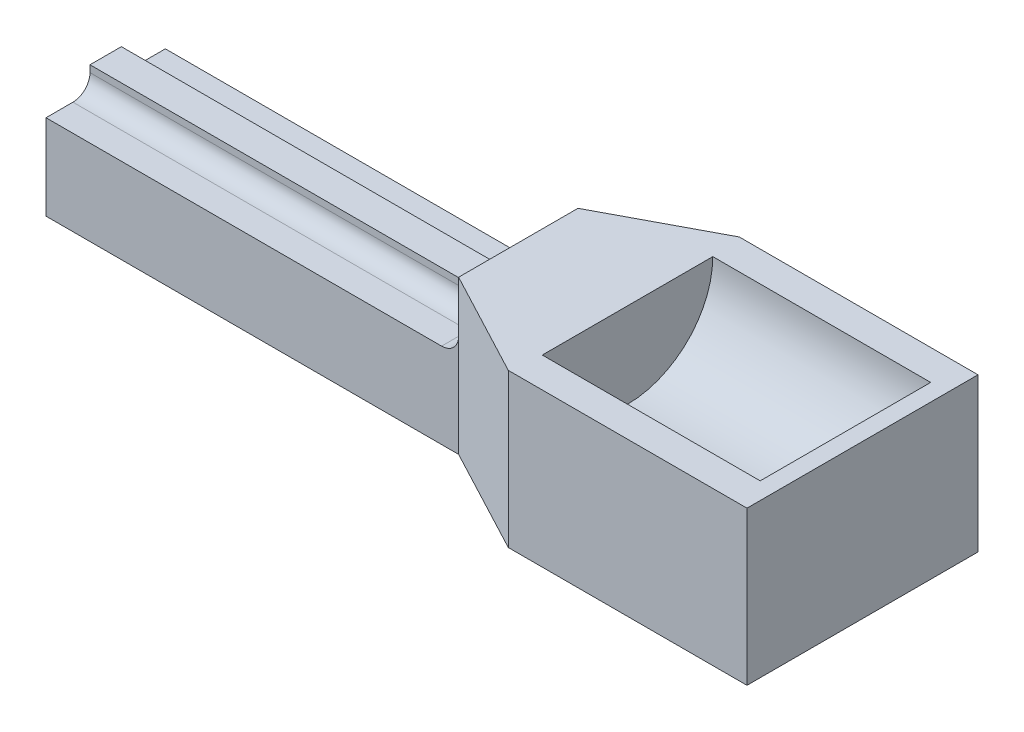
ISO-10303-21;
HEADER;
FILE_DESCRIPTION(('STEP AP214'),'2;1');
FILE_NAME('part.step','',(''),(''),'','','');
FILE_SCHEMA(('AUTOMOTIVE_DESIGN { 1 0 10303 214 1 1 1 1 }'));
ENDSEC;
DATA;
#1=APPLICATION_CONTEXT('core data for automotive mechanical design processes');
#2=APPLICATION_PROTOCOL_DEFINITION('international standard','automotive_design',2000,#1);
#3=PRODUCT_CONTEXT('',#1,'mechanical');
#4=PRODUCT('Part','Part','',(#3));
#5=PRODUCT_RELATED_PRODUCT_CATEGORY('part','',(#4));
#6=PRODUCT_DEFINITION_FORMATION('','',#4);
#7=PRODUCT_DEFINITION_CONTEXT('part definition',#1,'design');
#8=PRODUCT_DEFINITION('design','',#6,#7);
#9=PRODUCT_DEFINITION_SHAPE('','',#8);
#10=(LENGTH_UNIT() NAMED_UNIT(*) SI_UNIT(.MILLI.,.METRE.));
#11=(NAMED_UNIT(*) PLANE_ANGLE_UNIT() SI_UNIT($,.RADIAN.));
#12=(NAMED_UNIT(*) SI_UNIT($,.STERADIAN.) SOLID_ANGLE_UNIT());
#13=UNCERTAINTY_MEASURE_WITH_UNIT(LENGTH_MEASURE(1.E-05),#10,'distance_accuracy_value','');
#14=(GEOMETRIC_REPRESENTATION_CONTEXT(3) GLOBAL_UNCERTAINTY_ASSIGNED_CONTEXT((#13)) GLOBAL_UNIT_ASSIGNED_CONTEXT((#10,
#11,#12)) REPRESENTATION_CONTEXT('',''));
#15=CARTESIAN_POINT('',(0.,0.,0.));
#16=DIRECTION('',(0.,0.,1.));
#17=DIRECTION('',(1.,0.,0.));
#18=AXIS2_PLACEMENT_3D('',#15,#16,#17);
#19=CARTESIAN_POINT('',(295.934534334128,0.,0.));
#20=DIRECTION('',(-1.,0.,0.));
#21=DIRECTION('',(0.,0.,1.));
#22=AXIS2_PLACEMENT_3D('',#19,#20,#21);
#23=PLANE('',#22);
#24=DIRECTION('',(0.,0.,1.));
#25=VECTOR('',#24,1.);
#26=CARTESIAN_POINT('',(295.934534334128,45.,-33.87237262985));
#27=LINE('',#26,#25);
#28=CARTESIAN_POINT('',(295.934534334128,45.,-25.0000000000001));
#29=VERTEX_POINT('',#28);
#30=CARTESIAN_POINT('',(295.934534334128,45.,24.9999999999999));
#31=VERTEX_POINT('',#30);
#32=EDGE_CURVE('E190',#29,#31,#27,.T.);
#33=ORIENTED_EDGE('',*,*,#32,.F.);
#34=CARTESIAN_POINT('',(295.934534334128,45.,0.));
#35=DIRECTION('',(-1.,0.,0.));
#36=DIRECTION('',(0.,0.,1.));
#37=AXIS2_PLACEMENT_3D('',#34,#35,#36);
#38=CIRCLE('',#37,25.);
#39=EDGE_CURVE('E191',#29,#31,#38,.T.);
#40=ORIENTED_EDGE('',*,*,#39,.T.);
#41=EDGE_LOOP('',(#33,#40));
#42=FACE_BOUND('',#41,.T.);
#43=ADVANCED_FACE('F36',(#42),#23,.T.);
#44=CARTESIAN_POINT('',(295.934534334128,45.,-33.87237262985));
#45=DIRECTION('',(0.,0.,-1.));
#46=DIRECTION('',(0.,1.,0.));
#47=AXIS2_PLACEMENT_3D('',#44,#45,#46);
#48=PLANE('',#47);
#49=DIRECTION('',(0.,1.,0.));
#50=VECTOR('',#49,1.);
#51=CARTESIAN_POINT('',(300.934534334128,45.,-33.87237262985));
#52=LINE('',#51,#50);
#53=CARTESIAN_POINT('',(300.934534334128,0.,-33.87237262985));
#54=VERTEX_POINT('',#53);
#55=CARTESIAN_POINT('',(300.934534334128,45.,-33.87237262985));
#56=VERTEX_POINT('',#55);
#57=EDGE_CURVE('E193',#54,#56,#52,.T.);
#58=ORIENTED_EDGE('',*,*,#57,.F.);
#59=DIRECTION('',(1.,0.,0.));
#60=VECTOR('',#59,1.);
#61=CARTESIAN_POINT('',(295.934534334128,0.,-33.87237262985));
#62=LINE('',#61,#60);
#63=CARTESIAN_POINT('',(230.934534334128,0.,-33.87237262985));
#64=VERTEX_POINT('',#63);
#65=EDGE_CURVE('E11',#64,#54,#62,.T.);
#66=ORIENTED_EDGE('',*,*,#65,.F.);
#67=DIRECTION('',(0.,-1.,0.));
#68=VECTOR('',#67,1.);
#69=CARTESIAN_POINT('',(230.934534334128,45.,-33.87237262985));
#70=LINE('',#69,#68);
#71=CARTESIAN_POINT('',(230.934534334128,45.,-33.87237262985));
#72=VERTEX_POINT('',#71);
#73=EDGE_CURVE('E216',#72,#64,#70,.T.);
#74=ORIENTED_EDGE('',*,*,#73,.F.);
#75=DIRECTION('',(1.,0.,0.));
#76=VECTOR('',#75,1.);
#77=CARTESIAN_POINT('',(295.934534334128,45.,-33.87237262985));
#78=LINE('',#77,#76);
#79=EDGE_CURVE('E40',#72,#56,#78,.T.);
#80=ORIENTED_EDGE('',*,*,#79,.T.);
#81=EDGE_LOOP('',(#58,#66,#74,#80));
#82=FACE_BOUND('',#81,.T.);
#83=ADVANCED_FACE('F38',(#82),#48,.T.);
#84=CARTESIAN_POINT('',(295.934534334128,0.,-33.87237262985));
#85=DIRECTION('',(0.,-1.,0.));
#86=DIRECTION('',(0.,0.,-1.));
#87=AXIS2_PLACEMENT_3D('',#84,#85,#86);
#88=PLANE('',#87);
#89=DIRECTION('',(0.,0.,-1.));
#90=VECTOR('',#89,1.);
#91=CARTESIAN_POINT('',(300.934534334128,0.,-33.87237262985));
#92=LINE('',#91,#90);
#93=CARTESIAN_POINT('',(300.934534334128,0.,33.8723726298498));
#94=VERTEX_POINT('',#93);
#95=EDGE_CURVE('E198',#94,#54,#92,.T.);
#96=ORIENTED_EDGE('',*,*,#95,.F.);
#97=DIRECTION('',(1.,0.,0.));
#98=VECTOR('',#97,1.);
#99=CARTESIAN_POINT('',(295.934534334128,0.,33.8723726298498));
#100=LINE('',#99,#98);
#101=CARTESIAN_POINT('',(230.934534334128,0.,33.8723726298498));
#102=VERTEX_POINT('',#101);
#103=EDGE_CURVE('E45',#102,#94,#100,.T.);
#104=ORIENTED_EDGE('',*,*,#103,.F.);
#105=DIRECTION('',(0.883843838117942,0.,0.467782075138569));
#106=VECTOR('',#105,1.);
#107=CARTESIAN_POINT('',(200.,0.,17.4999999999999));
#108=LINE('',#107,#106);
#109=CARTESIAN_POINT('',(200.,0.,17.4999999999999));
#110=VERTEX_POINT('',#109);
#111=EDGE_CURVE('E224',#110,#102,#108,.T.);
#112=ORIENTED_EDGE('',*,*,#111,.F.);
#113=DIRECTION('',(1.,0.,0.));
#114=VECTOR('',#113,1.);
#115=CARTESIAN_POINT('',(-210.,0.,17.5));
#116=LINE('',#115,#114);
#117=CARTESIAN_POINT('',(79.,0.,17.5));
#118=VERTEX_POINT('',#117);
#119=EDGE_CURVE('E250',#118,#110,#116,.T.);
#120=ORIENTED_EDGE('',*,*,#119,.F.);
#121=DIRECTION('',(0.,0.,-1.));
#122=VECTOR('',#121,1.);
#123=CARTESIAN_POINT('',(79.,0.,0.));
#124=LINE('',#123,#122);
#125=CARTESIAN_POINT('',(79.,0.,-17.5000000000001));
#126=VERTEX_POINT('',#125);
#127=EDGE_CURVE('E285',#118,#126,#124,.T.);
#128=ORIENTED_EDGE('',*,*,#127,.T.);
#129=DIRECTION('',(1.,0.,0.));
#130=VECTOR('',#129,1.);
#131=CARTESIAN_POINT('',(-210.,0.,-17.5));
#132=LINE('',#131,#130);
#133=CARTESIAN_POINT('',(200.,0.,-17.5000000000001));
#134=VERTEX_POINT('',#133);
#135=EDGE_CURVE('E248',#126,#134,#132,.T.);
#136=ORIENTED_EDGE('',*,*,#135,.T.);
#137=DIRECTION('',(-0.883843838117942,0.,0.467782075138569));
#138=VECTOR('',#137,1.);
#139=CARTESIAN_POINT('',(230.934534334128,0.,-33.87237262985));
#140=LINE('',#139,#138);
#141=EDGE_CURVE('E237',#64,#134,#140,.T.);
#142=ORIENTED_EDGE('',*,*,#141,.F.);
#143=ORIENTED_EDGE('',*,*,#65,.T.);
#144=EDGE_LOOP('',(#96,#104,#112,#120,#128,#136,#142,#143));
#145=FACE_BOUND('',#144,.T.);
#146=ADVANCED_FACE('F220',(#145),#88,.T.);
#147=CARTESIAN_POINT('',(295.934534334128,45.,33.8723726298498));
#148=DIRECTION('',(0.,0.,1.));
#149=DIRECTION('',(0.,-1.,0.));
#150=AXIS2_PLACEMENT_3D('',#147,#148,#149);
#151=PLANE('',#150);
#152=DIRECTION('',(0.,-1.,0.));
#153=VECTOR('',#152,1.);
#154=CARTESIAN_POINT('',(300.934534334128,45.,33.8723726298498));
#155=LINE('',#154,#153);
#156=CARTESIAN_POINT('',(300.934534334128,45.,33.8723726298498));
#157=VERTEX_POINT('',#156);
#158=EDGE_CURVE('E203',#157,#94,#155,.T.);
#159=ORIENTED_EDGE('',*,*,#158,.F.);
#160=DIRECTION('',(1.,0.,0.));
#161=VECTOR('',#160,1.);
#162=CARTESIAN_POINT('',(295.934534334128,45.,33.8723726298498));
#163=LINE('',#162,#161);
#164=CARTESIAN_POINT('',(230.934534334128,45.,33.8723726298498));
#165=VERTEX_POINT('',#164);
#166=EDGE_CURVE('E208',#165,#157,#163,.T.);
#167=ORIENTED_EDGE('',*,*,#166,.F.);
#168=DIRECTION('',(0.,-1.,0.));
#169=VECTOR('',#168,1.);
#170=CARTESIAN_POINT('',(230.934534334128,45.,33.8723726298498));
#171=LINE('',#170,#169);
#172=EDGE_CURVE('E227',#165,#102,#171,.T.);
#173=ORIENTED_EDGE('',*,*,#172,.T.);
#174=ORIENTED_EDGE('',*,*,#103,.T.);
#175=EDGE_LOOP('',(#159,#167,#173,#174));
#176=FACE_BOUND('',#175,.T.);
#177=ADVANCED_FACE('F228',(#176),#151,.T.);
#178=CARTESIAN_POINT('',(295.934534334128,45.,-33.87237262985));
#179=DIRECTION('',(0.,1.,0.));
#180=DIRECTION('',(0.,0.,1.));
#181=AXIS2_PLACEMENT_3D('',#178,#179,#180);
#182=PLANE('',#181);
#183=DIRECTION('',(1.,0.,0.));
#184=VECTOR('',#183,1.);
#185=CARTESIAN_POINT('',(232.034534334128,45.,-25.0000000000001));
#186=LINE('',#185,#184);
#187=CARTESIAN_POINT('',(232.034534334128,45.,-25.0000000000001));
#188=VERTEX_POINT('',#187);
#189=EDGE_CURVE('E180',#29,#188,#186,.F.);
#190=ORIENTED_EDGE('',*,*,#189,.F.);
#191=ORIENTED_EDGE('',*,*,#32,.T.);
#192=DIRECTION('',(1.,0.,0.));
#193=VECTOR('',#192,1.);
#194=CARTESIAN_POINT('',(232.034534334128,45.,24.9999999999999));
#195=LINE('',#194,#193);
#196=CARTESIAN_POINT('',(232.034534334128,45.,24.9999999999999));
#197=VERTEX_POINT('',#196);
#198=EDGE_CURVE('E53',#197,#31,#195,.T.);
#199=ORIENTED_EDGE('',*,*,#198,.F.);
#200=DIRECTION('',(0.,0.,-1.));
#201=VECTOR('',#200,1.);
#202=CARTESIAN_POINT('',(232.034534334128,45.,0.));
#203=LINE('',#202,#201);
#204=EDGE_CURVE('E175',#197,#188,#203,.T.);
#205=ORIENTED_EDGE('',*,*,#204,.T.);
#206=EDGE_LOOP('',(#190,#191,#199,#205));
#207=FACE_BOUND('',#206,.T.);
#208=ORIENTED_EDGE('',*,*,#79,.F.);
#209=DIRECTION('',(-0.883843838117942,0.,0.467782075138569));
#210=VECTOR('',#209,1.);
#211=CARTESIAN_POINT('',(230.934534334128,45.,-33.87237262985));
#212=LINE('',#211,#210);
#213=CARTESIAN_POINT('',(200.,45.,-17.5000000000001));
#214=VERTEX_POINT('',#213);
#215=EDGE_CURVE('E344',#72,#214,#212,.T.);
#216=ORIENTED_EDGE('',*,*,#215,.T.);
#217=DIRECTION('',(0.,0.,1.));
#218=VECTOR('',#217,1.);
#219=CARTESIAN_POINT('',(200.,45.,-17.5000000000001));
#220=LINE('',#219,#218);
#221=CARTESIAN_POINT('',(200.,45.,17.4999999999999));
#222=VERTEX_POINT('',#221);
#223=EDGE_CURVE('E242',#214,#222,#220,.T.);
#224=ORIENTED_EDGE('',*,*,#223,.T.);
#225=DIRECTION('',(0.883843838117942,0.,0.467782075138569));
#226=VECTOR('',#225,1.);
#227=CARTESIAN_POINT('',(200.,45.,17.4999999999999));
#228=LINE('',#227,#226);
#229=EDGE_CURVE('E346',#222,#165,#228,.T.);
#230=ORIENTED_EDGE('',*,*,#229,.T.);
#231=ORIENTED_EDGE('',*,*,#166,.T.);
#232=DIRECTION('',(0.,0.,1.));
#233=VECTOR('',#232,1.);
#234=CARTESIAN_POINT('',(300.934534334128,45.,-33.87237262985));
#235=LINE('',#234,#233);
#236=EDGE_CURVE('E201',#56,#157,#235,.T.);
#237=ORIENTED_EDGE('',*,*,#236,.F.);
#238=EDGE_LOOP('',(#208,#216,#224,#230,#231,#237));
#239=FACE_BOUND('',#238,.T.);
#240=ADVANCED_FACE('F187',(#207,#239),#182,.T.);
#241=CARTESIAN_POINT('',(300.934534334128,0.,0.));
#242=DIRECTION('',(-1.,0.,0.));
#243=DIRECTION('',(0.,0.,1.));
#244=AXIS2_PLACEMENT_3D('',#241,#242,#243);
#245=PLANE('',#244);
#246=ORIENTED_EDGE('',*,*,#236,.T.);
#247=ORIENTED_EDGE('',*,*,#158,.T.);
#248=ORIENTED_EDGE('',*,*,#95,.T.);
#249=ORIENTED_EDGE('',*,*,#57,.T.);
#250=EDGE_LOOP('',(#246,#247,#248,#249));
#251=FACE_BOUND('',#250,.T.);
#252=ADVANCED_FACE('F219',(#251),#245,.F.);
#253=CARTESIAN_POINT('',(79.,45.01,-81.1966355679578));
#254=DIRECTION('',(-1.,0.,0.));
#255=DIRECTION('',(0.,0.,1.));
#256=AXIS2_PLACEMENT_3D('',#253,#254,#255);
#257=PLANE('',#256);
#258=DIRECTION('',(0.,1.,0.));
#259=VECTOR('',#258,1.);
#260=CARTESIAN_POINT('',(79.,25.,17.5));
#261=LINE('',#260,#259);
#262=CARTESIAN_POINT('',(79.,25.,17.5));
#263=VERTEX_POINT('',#262);
#264=EDGE_CURVE('E276',#118,#263,#261,.T.);
#265=ORIENTED_EDGE('',*,*,#264,.T.);
#266=DIRECTION('',(0.,0.,-1.));
#267=VECTOR('',#266,1.);
#268=CARTESIAN_POINT('',(79.,25.,0.));
#269=LINE('',#268,#267);
#270=CARTESIAN_POINT('',(79.,25.,9.60000000000005));
#271=VERTEX_POINT('',#270);
#272=EDGE_CURVE('E279',#263,#271,#269,.T.);
#273=ORIENTED_EDGE('',*,*,#272,.T.);
#274=CARTESIAN_POINT('',(79.,30.,9.60000000000005));
#275=DIRECTION('',(-1.,0.,0.));
#276=DIRECTION('',(0.,0.,1.));
#277=AXIS2_PLACEMENT_3D('',#274,#275,#276);
#278=CIRCLE('',#277,5.);
#279=CARTESIAN_POINT('',(79.,30.,4.60000000000004));
#280=VERTEX_POINT('',#279);
#281=EDGE_CURVE('E267',#271,#280,#278,.F.);
#282=ORIENTED_EDGE('',*,*,#281,.T.);
#283=DIRECTION('',(0.,1.,0.));
#284=VECTOR('',#283,1.);
#285=CARTESIAN_POINT('',(79.,32.,4.60000000000004));
#286=LINE('',#285,#284);
#287=CARTESIAN_POINT('',(79.,32.,4.60000000000004));
#288=VERTEX_POINT('',#287);
#289=EDGE_CURVE('E273',#280,#288,#286,.T.);
#290=ORIENTED_EDGE('',*,*,#289,.T.);
#291=DIRECTION('',(0.,0.,1.));
#292=VECTOR('',#291,1.);
#293=CARTESIAN_POINT('',(79.,32.,0.));
#294=LINE('',#293,#292);
#295=CARTESIAN_POINT('',(79.,32.,-4.6));
#296=VERTEX_POINT('',#295);
#297=EDGE_CURVE('E290',#296,#288,#294,.T.);
#298=ORIENTED_EDGE('',*,*,#297,.F.);
#299=DIRECTION('',(0.,-1.,0.));
#300=VECTOR('',#299,1.);
#301=CARTESIAN_POINT('',(79.,32.,-4.6));
#302=LINE('',#301,#300);
#303=CARTESIAN_POINT('',(79.,30.,-4.6));
#304=VERTEX_POINT('',#303);
#305=EDGE_CURVE('E270',#296,#304,#302,.T.);
#306=ORIENTED_EDGE('',*,*,#305,.T.);
#307=CARTESIAN_POINT('',(79.,30.,-9.6));
#308=DIRECTION('',(-1.,0.,0.));
#309=DIRECTION('',(0.,0.,1.));
#310=AXIS2_PLACEMENT_3D('',#307,#308,#309);
#311=CIRCLE('',#310,5.);
#312=CARTESIAN_POINT('',(79.,25.,-9.6));
#313=VERTEX_POINT('',#312);
#314=EDGE_CURVE('E184',#304,#313,#311,.F.);
#315=ORIENTED_EDGE('',*,*,#314,.T.);
#316=DIRECTION('',(0.,0.,-1.));
#317=VECTOR('',#316,1.);
#318=CARTESIAN_POINT('',(79.,25.,0.));
#319=LINE('',#318,#317);
#320=CARTESIAN_POINT('',(79.,25.,-17.5000000000001));
#321=VERTEX_POINT('',#320);
#322=EDGE_CURVE('E282',#313,#321,#319,.T.);
#323=ORIENTED_EDGE('',*,*,#322,.T.);
#324=DIRECTION('',(0.,1.,0.));
#325=VECTOR('',#324,1.);
#326=CARTESIAN_POINT('',(79.,25.,-17.5000000000001));
#327=LINE('',#326,#325);
#328=EDGE_CURVE('E288',#126,#321,#327,.T.);
#329=ORIENTED_EDGE('',*,*,#328,.F.);
#330=ORIENTED_EDGE('',*,*,#127,.F.);
#331=EDGE_LOOP('',(#265,#273,#282,#290,#298,#306,#315,#323,#329,#330));
#332=FACE_BOUND('',#331,.T.);
#333=ADVANCED_FACE('F366',(#332),#257,.T.);
#334=CARTESIAN_POINT('',(0.,25.,0.));
#335=DIRECTION('',(0.,-1.,0.));
#336=DIRECTION('',(0.,0.,-1.));
#337=AXIS2_PLACEMENT_3D('',#334,#335,#336);
#338=PLANE('',#337);
#339=ORIENTED_EDGE('',*,*,#322,.F.);
#340=DIRECTION('',(-1.,0.,0.));
#341=VECTOR('',#340,1.);
#342=CARTESIAN_POINT('',(200.,25.,-9.6));
#343=LINE('',#342,#341);
#344=CARTESIAN_POINT('',(195.,25.,-9.6));
#345=VERTEX_POINT('',#344);
#346=EDGE_CURVE('E260',#313,#345,#343,.F.);
#347=ORIENTED_EDGE('',*,*,#346,.T.);
#348=DIRECTION('',(0.,0.,1.));
#349=VECTOR('',#348,1.);
#350=CARTESIAN_POINT('',(195.,25.,-17.5000000000001));
#351=LINE('',#350,#349);
#352=CARTESIAN_POINT('',(195.,25.,-17.5000000000001));
#353=VERTEX_POINT('',#352);
#354=EDGE_CURVE('E303',#345,#353,#351,.F.);
#355=ORIENTED_EDGE('',*,*,#354,.T.);
#356=DIRECTION('',(1.,0.,0.));
#357=VECTOR('',#356,1.);
#358=CARTESIAN_POINT('',(-210.,25.,-17.5));
#359=LINE('',#358,#357);
#360=EDGE_CURVE('E252',#321,#353,#359,.T.);
#361=ORIENTED_EDGE('',*,*,#360,.F.);
#362=EDGE_LOOP('',(#339,#347,#355,#361));
#363=FACE_BOUND('',#362,.T.);
#364=ADVANCED_FACE('F430',(#363),#338,.F.);
#365=ORIENTED_EDGE('',*,*,#272,.F.);
#366=DIRECTION('',(1.,0.,0.));
#367=VECTOR('',#366,1.);
#368=CARTESIAN_POINT('',(-210.,25.,17.5));
#369=LINE('',#368,#367);
#370=CARTESIAN_POINT('',(195.,25.,17.5));
#371=VERTEX_POINT('',#370);
#372=EDGE_CURVE('E254',#263,#371,#369,.T.);
#373=ORIENTED_EDGE('',*,*,#372,.T.);
#374=DIRECTION('',(0.,0.,1.));
#375=VECTOR('',#374,1.);
#376=CARTESIAN_POINT('',(195.,25.,9.6));
#377=LINE('',#376,#375);
#378=CARTESIAN_POINT('',(195.,25.,9.6));
#379=VERTEX_POINT('',#378);
#380=EDGE_CURVE('E310',#371,#379,#377,.F.);
#381=ORIENTED_EDGE('',*,*,#380,.T.);
#382=DIRECTION('',(1.,0.,0.));
#383=VECTOR('',#382,1.);
#384=CARTESIAN_POINT('',(-8.35065268889029,25.,9.60000000000008));
#385=LINE('',#384,#383);
#386=EDGE_CURVE('E256',#379,#271,#385,.F.);
#387=ORIENTED_EDGE('',*,*,#386,.T.);
#388=EDGE_LOOP('',(#365,#373,#381,#387));
#389=FACE_BOUND('',#388,.T.);
#390=ADVANCED_FACE('F417',(#389),#338,.F.);
#391=CARTESIAN_POINT('',(-210.,25.,17.5));
#392=DIRECTION('',(0.,0.,-1.));
#393=DIRECTION('',(-1.,0.,0.));
#394=AXIS2_PLACEMENT_3D('',#391,#392,#393);
#395=PLANE('',#394);
#396=ORIENTED_EDGE('',*,*,#264,.F.);
#397=ORIENTED_EDGE('',*,*,#119,.T.);
#398=DIRECTION('',(0.,-1.,0.));
#399=VECTOR('',#398,1.);
#400=CARTESIAN_POINT('',(200.,25.,17.4999999999999));
#401=LINE('',#400,#399);
#402=CARTESIAN_POINT('',(200.,30.,17.4999999999999));
#403=VERTEX_POINT('',#402);
#404=EDGE_CURVE('E235',#403,#110,#401,.T.);
#405=ORIENTED_EDGE('',*,*,#404,.F.);
#406=CARTESIAN_POINT('',(195.,30.,17.4999999999999));
#407=DIRECTION('',(0.,0.,-1.));
#408=DIRECTION('',(-1.,0.,0.));
#409=AXIS2_PLACEMENT_3D('',#406,#407,#408);
#410=CIRCLE('',#409,5.);
#411=EDGE_CURVE('E296',#403,#371,#410,.T.);
#412=ORIENTED_EDGE('',*,*,#411,.T.);
#413=ORIENTED_EDGE('',*,*,#372,.F.);
#414=EDGE_LOOP('',(#396,#397,#405,#412,#413));
#415=FACE_BOUND('',#414,.T.);
#416=ADVANCED_FACE('F361',(#415),#395,.F.);
#417=CARTESIAN_POINT('',(-210.,25.,-17.5));
#418=DIRECTION('',(0.,0.,-1.));
#419=DIRECTION('',(-1.,0.,0.));
#420=AXIS2_PLACEMENT_3D('',#417,#418,#419);
#421=PLANE('',#420);
#422=ORIENTED_EDGE('',*,*,#135,.F.);
#423=ORIENTED_EDGE('',*,*,#328,.T.);
#424=ORIENTED_EDGE('',*,*,#360,.T.);
#425=CARTESIAN_POINT('',(195.,30.,-17.5000000000001));
#426=DIRECTION('',(0.,0.,-1.));
#427=DIRECTION('',(-1.,0.,0.));
#428=AXIS2_PLACEMENT_3D('',#425,#426,#427);
#429=CIRCLE('',#428,5.);
#430=CARTESIAN_POINT('',(200.,30.,-17.5000000000001));
#431=VERTEX_POINT('',#430);
#432=EDGE_CURVE('E292',#353,#431,#429,.F.);
#433=ORIENTED_EDGE('',*,*,#432,.T.);
#434=DIRECTION('',(0.,1.,0.));
#435=VECTOR('',#434,1.);
#436=CARTESIAN_POINT('',(200.,0.,-17.5000000000001));
#437=LINE('',#436,#435);
#438=EDGE_CURVE('E337',#134,#431,#437,.T.);
#439=ORIENTED_EDGE('',*,*,#438,.F.);
#440=EDGE_LOOP('',(#422,#423,#424,#433,#439));
#441=FACE_BOUND('',#440,.T.);
#442=ADVANCED_FACE('F369',(#441),#421,.T.);
#443=CARTESIAN_POINT('',(-21.,32.,0.));
#444=DIRECTION('',(0.,1.,0.));
#445=DIRECTION('',(0.,0.,1.));
#446=AXIS2_PLACEMENT_3D('',#443,#444,#445);
#447=PLANE('',#446);
#448=DIRECTION('',(-1.,0.,0.));
#449=VECTOR('',#448,1.);
#450=CARTESIAN_POINT('',(200.,32.,-4.6));
#451=LINE('',#450,#449);
#452=CARTESIAN_POINT('',(195.,32.,-4.6));
#453=VERTEX_POINT('',#452);
#454=EDGE_CURVE('E236',#453,#296,#451,.T.);
#455=ORIENTED_EDGE('',*,*,#454,.T.);
#456=ORIENTED_EDGE('',*,*,#297,.T.);
#457=DIRECTION('',(1.,0.,0.));
#458=VECTOR('',#457,1.);
#459=CARTESIAN_POINT('',(200.,32.,4.6));
#460=LINE('',#459,#458);
#461=CARTESIAN_POINT('',(195.,32.,4.6));
#462=VERTEX_POINT('',#461);
#463=EDGE_CURVE('E239',#288,#462,#460,.T.);
#464=ORIENTED_EDGE('',*,*,#463,.T.);
#465=DIRECTION('',(0.,0.,-1.));
#466=VECTOR('',#465,1.);
#467=CARTESIAN_POINT('',(195.,32.,0.));
#468=LINE('',#467,#466);
#469=EDGE_CURVE('E312',#462,#453,#468,.T.);
#470=ORIENTED_EDGE('',*,*,#469,.T.);
#471=EDGE_LOOP('',(#455,#456,#464,#470));
#472=FACE_BOUND('',#471,.T.);
#473=ADVANCED_FACE('F421',(#472),#447,.T.);
#474=CARTESIAN_POINT('',(200.,32.,4.6));
#475=DIRECTION('',(0.,0.,-1.));
#476=DIRECTION('',(-1.,0.,0.));
#477=AXIS2_PLACEMENT_3D('',#474,#475,#476);
#478=PLANE('',#477);
#479=ORIENTED_EDGE('',*,*,#289,.F.);
#480=DIRECTION('',(1.,0.,0.));
#481=VECTOR('',#480,1.);
#482=CARTESIAN_POINT('',(200.,30.,4.6));
#483=LINE('',#482,#481);
#484=CARTESIAN_POINT('',(195.,30.,4.6));
#485=VERTEX_POINT('',#484);
#486=EDGE_CURVE('E258',#280,#485,#483,.T.);
#487=ORIENTED_EDGE('',*,*,#486,.T.);
#488=DIRECTION('',(0.,-1.,0.));
#489=VECTOR('',#488,1.);
#490=CARTESIAN_POINT('',(195.,32.,4.6));
#491=LINE('',#490,#489);
#492=EDGE_CURVE('E322',#485,#462,#491,.F.);
#493=ORIENTED_EDGE('',*,*,#492,.T.);
#494=ORIENTED_EDGE('',*,*,#463,.F.);
#495=EDGE_LOOP('',(#479,#487,#493,#494));
#496=FACE_BOUND('',#495,.T.);
#497=ADVANCED_FACE('F420',(#496),#478,.F.);
#498=CARTESIAN_POINT('',(200.,32.,-4.6));
#499=DIRECTION('',(0.,0.,1.));
#500=DIRECTION('',(1.,0.,0.));
#501=AXIS2_PLACEMENT_3D('',#498,#499,#500);
#502=PLANE('',#501);
#503=ORIENTED_EDGE('',*,*,#305,.F.);
#504=ORIENTED_EDGE('',*,*,#454,.F.);
#505=DIRECTION('',(0.,-1.,0.));
#506=VECTOR('',#505,1.);
#507=CARTESIAN_POINT('',(195.,30.,-4.6));
#508=LINE('',#507,#506);
#509=CARTESIAN_POINT('',(195.,30.,-4.6));
#510=VERTEX_POINT('',#509);
#511=EDGE_CURVE('E317',#453,#510,#508,.T.);
#512=ORIENTED_EDGE('',*,*,#511,.T.);
#513=DIRECTION('',(-1.,0.,0.));
#514=VECTOR('',#513,1.);
#515=CARTESIAN_POINT('',(-8.35065268889029,30.,-4.6));
#516=LINE('',#515,#514);
#517=EDGE_CURVE('E262',#510,#304,#516,.T.);
#518=ORIENTED_EDGE('',*,*,#517,.T.);
#519=EDGE_LOOP('',(#503,#504,#512,#518));
#520=FACE_BOUND('',#519,.T.);
#521=ADVANCED_FACE('F424',(#520),#502,.F.);
#522=CARTESIAN_POINT('',(200.,30.,9.6));
#523=DIRECTION('',(-1.,0.,0.));
#524=DIRECTION('',(0.,0.,1.));
#525=AXIS2_PLACEMENT_3D('',#522,#523,#524);
#526=CYLINDRICAL_SURFACE('',#525,5.);
#527=ORIENTED_EDGE('',*,*,#281,.F.);
#528=ORIENTED_EDGE('',*,*,#386,.F.);
#529=CARTESIAN_POINT('',(195.,30.,9.6));
#530=DIRECTION('',(-1.,0.,0.));
#531=DIRECTION('',(0.,0.,1.));
#532=AXIS2_PLACEMENT_3D('',#529,#530,#531);
#533=CIRCLE('',#532,5.);
#534=EDGE_CURVE('E319',#379,#485,#533,.F.);
#535=ORIENTED_EDGE('',*,*,#534,.T.);
#536=ORIENTED_EDGE('',*,*,#486,.F.);
#537=EDGE_LOOP('',(#527,#528,#535,#536));
#538=FACE_BOUND('',#537,.T.);
#539=ADVANCED_FACE('F414',(#538),#526,.F.);
#540=CARTESIAN_POINT('',(200.,30.,-9.6));
#541=DIRECTION('',(1.,0.,0.));
#542=DIRECTION('',(0.,0.,-1.));
#543=AXIS2_PLACEMENT_3D('',#540,#541,#542);
#544=CYLINDRICAL_SURFACE('',#543,5.);
#545=ORIENTED_EDGE('',*,*,#314,.F.);
#546=ORIENTED_EDGE('',*,*,#517,.F.);
#547=CARTESIAN_POINT('',(195.,30.,-9.6));
#548=DIRECTION('',(1.,0.,0.));
#549=DIRECTION('',(0.,0.,-1.));
#550=AXIS2_PLACEMENT_3D('',#547,#548,#549);
#551=CIRCLE('',#550,5.);
#552=EDGE_CURVE('E314',#510,#345,#551,.T.);
#553=ORIENTED_EDGE('',*,*,#552,.T.);
#554=ORIENTED_EDGE('',*,*,#346,.F.);
#555=EDGE_LOOP('',(#545,#546,#553,#554));
#556=FACE_BOUND('',#555,.T.);
#557=ADVANCED_FACE('F428',(#556),#544,.F.);
#558=CARTESIAN_POINT('',(200.,45.,-17.5000000000001));
#559=DIRECTION('',(1.,0.,0.));
#560=DIRECTION('',(0.,0.,-1.));
#561=AXIS2_PLACEMENT_3D('',#558,#559,#560);
#562=PLANE('',#561);
#563=DIRECTION('',(0.,-1.,0.));
#564=VECTOR('',#563,1.);
#565=CARTESIAN_POINT('',(200.,30.,9.6));
#566=LINE('',#565,#564);
#567=CARTESIAN_POINT('',(200.,37.,9.6));
#568=VERTEX_POINT('',#567);
#569=CARTESIAN_POINT('',(200.,30.,9.6));
#570=VERTEX_POINT('',#569);
#571=EDGE_CURVE('E328',#568,#570,#566,.T.);
#572=ORIENTED_EDGE('',*,*,#571,.T.);
#573=DIRECTION('',(0.,0.,1.));
#574=VECTOR('',#573,1.);
#575=CARTESIAN_POINT('',(200.,30.,17.4999999999999));
#576=LINE('',#575,#574);
#577=EDGE_CURVE('E325',#570,#403,#576,.T.);
#578=ORIENTED_EDGE('',*,*,#577,.T.);
#579=DIRECTION('',(0.,-1.,0.));
#580=VECTOR('',#579,1.);
#581=CARTESIAN_POINT('',(200.,45.,17.4999999999999));
#582=LINE('',#581,#580);
#583=EDGE_CURVE('E230',#222,#403,#582,.T.);
#584=ORIENTED_EDGE('',*,*,#583,.F.);
#585=ORIENTED_EDGE('',*,*,#223,.F.);
#586=DIRECTION('',(0.,-1.,0.));
#587=VECTOR('',#586,1.);
#588=CARTESIAN_POINT('',(200.,45.,-17.5000000000001));
#589=LINE('',#588,#587);
#590=EDGE_CURVE('E341',#214,#431,#589,.T.);
#591=ORIENTED_EDGE('',*,*,#590,.T.);
#592=DIRECTION('',(0.,0.,1.));
#593=VECTOR('',#592,1.);
#594=CARTESIAN_POINT('',(200.,30.,-9.6));
#595=LINE('',#594,#593);
#596=CARTESIAN_POINT('',(200.,30.,-9.6));
#597=VERTEX_POINT('',#596);
#598=EDGE_CURVE('E264',#431,#597,#595,.T.);
#599=ORIENTED_EDGE('',*,*,#598,.T.);
#600=DIRECTION('',(0.,-1.,0.));
#601=VECTOR('',#600,1.);
#602=CARTESIAN_POINT('',(200.,32.,-9.6));
#603=LINE('',#602,#601);
#604=CARTESIAN_POINT('',(200.,37.,-9.6));
#605=VERTEX_POINT('',#604);
#606=EDGE_CURVE('E333',#597,#605,#603,.F.);
#607=ORIENTED_EDGE('',*,*,#606,.T.);
#608=DIRECTION('',(0.,0.,-1.));
#609=VECTOR('',#608,1.);
#610=CARTESIAN_POINT('',(200.,37.,-17.5000000000001));
#611=LINE('',#610,#609);
#612=EDGE_CURVE('E331',#605,#568,#611,.F.);
#613=ORIENTED_EDGE('',*,*,#612,.T.);
#614=EDGE_LOOP('',(#572,#578,#584,#585,#591,#599,#607,#613));
#615=FACE_BOUND('',#614,.T.);
#616=ADVANCED_FACE('F352',(#615),#562,.F.);
#617=CARTESIAN_POINT('',(200.,45.,17.4999999999999));
#618=DIRECTION('',(0.467782075138569,0.,-0.883843838117942));
#619=DIRECTION('',(-0.883843838117942,0.,-0.467782075138569));
#620=AXIS2_PLACEMENT_3D('',#617,#618,#619);
#621=PLANE('',#620);
#622=ORIENTED_EDGE('',*,*,#583,.T.);
#623=ORIENTED_EDGE('',*,*,#404,.T.);
#624=ORIENTED_EDGE('',*,*,#111,.T.);
#625=ORIENTED_EDGE('',*,*,#172,.F.);
#626=ORIENTED_EDGE('',*,*,#229,.F.);
#627=EDGE_LOOP('',(#622,#623,#624,#625,#626));
#628=FACE_BOUND('',#627,.T.);
#629=ADVANCED_FACE('F234',(#628),#621,.F.);
#630=CARTESIAN_POINT('',(230.934534334128,45.,-33.87237262985));
#631=DIRECTION('',(0.467782075138569,0.,0.883843838117942));
#632=DIRECTION('',(0.883843838117942,0.,-0.467782075138569));
#633=AXIS2_PLACEMENT_3D('',#630,#631,#632);
#634=PLANE('',#633);
#635=ORIENTED_EDGE('',*,*,#73,.T.);
#636=ORIENTED_EDGE('',*,*,#141,.T.);
#637=ORIENTED_EDGE('',*,*,#438,.T.);
#638=ORIENTED_EDGE('',*,*,#590,.F.);
#639=ORIENTED_EDGE('',*,*,#215,.F.);
#640=EDGE_LOOP('',(#635,#636,#637,#638,#639));
#641=FACE_BOUND('',#640,.T.);
#642=ADVANCED_FACE('F371',(#641),#634,.F.);
#643=CARTESIAN_POINT('',(195.,30.,-17.5000000000001));
#644=DIRECTION('',(0.,0.,-1.));
#645=DIRECTION('',(-1.,0.,0.));
#646=AXIS2_PLACEMENT_3D('',#643,#644,#645);
#647=CYLINDRICAL_SURFACE('',#646,5.);
#648=ORIENTED_EDGE('',*,*,#432,.F.);
#649=ORIENTED_EDGE('',*,*,#354,.F.);
#650=CARTESIAN_POINT('',(195.,30.,-9.6));
#651=DIRECTION('',(0.,0.,-1.));
#652=DIRECTION('',(-1.,0.,0.));
#653=AXIS2_PLACEMENT_3D('',#650,#651,#652);
#654=CIRCLE('',#653,5.);
#655=EDGE_CURVE('E246',#597,#345,#654,.T.);
#656=ORIENTED_EDGE('',*,*,#655,.F.);
#657=ORIENTED_EDGE('',*,*,#598,.F.);
#658=EDGE_LOOP('',(#648,#649,#656,#657));
#659=FACE_BOUND('',#658,.T.);
#660=ADVANCED_FACE('F379',(#659),#647,.F.);
#661=CARTESIAN_POINT('',(195.,30.,-9.6));
#662=DIRECTION('',(1.,0.,0.));
#663=DIRECTION('',(0.,0.,-1.));
#664=AXIS2_PLACEMENT_3D('',#661,#662,#663);
#665=SPHERICAL_SURFACE('',#664,5.);
#666=ORIENTED_EDGE('',*,*,#655,.T.);
#667=ORIENTED_EDGE('',*,*,#552,.F.);
#668=CARTESIAN_POINT('',(195.,30.,-9.6));
#669=DIRECTION('',(0.,-1.,0.));
#670=DIRECTION('',(0.,0.,-1.));
#671=AXIS2_PLACEMENT_3D('',#668,#669,#670);
#672=CIRCLE('',#671,5.);
#673=EDGE_CURVE('E382',#597,#510,#672,.T.);
#674=ORIENTED_EDGE('',*,*,#673,.F.);
#675=EDGE_LOOP('',(#666,#667,#674));
#676=FACE_BOUND('',#675,.T.);
#677=ADVANCED_FACE('F385',(#676),#665,.F.);
#678=CARTESIAN_POINT('',(195.,32.,-9.6));
#679=DIRECTION('',(0.,1.,0.));
#680=DIRECTION('',(0.,0.,1.));
#681=AXIS2_PLACEMENT_3D('',#678,#679,#680);
#682=CYLINDRICAL_SURFACE('',#681,5.);
#683=ORIENTED_EDGE('',*,*,#673,.T.);
#684=ORIENTED_EDGE('',*,*,#511,.F.);
#685=CARTESIAN_POINT('',(195.,37.,-9.6));
#686=DIRECTION('',(0.,-0.707106781186547,-0.707106781186547));
#687=DIRECTION('',(0.,0.707106781186547,-0.707106781186547));
#688=AXIS2_PLACEMENT_3D('',#685,#686,#687);
#689=ELLIPSE('',#688,7.07106781186547,5.);
#690=EDGE_CURVE('E388',#605,#453,#689,.T.);
#691=ORIENTED_EDGE('',*,*,#690,.F.);
#692=ORIENTED_EDGE('',*,*,#606,.F.);
#693=EDGE_LOOP('',(#683,#684,#691,#692));
#694=FACE_BOUND('',#693,.T.);
#695=ADVANCED_FACE('F390',(#694),#682,.F.);
#696=CARTESIAN_POINT('',(195.,30.,-17.5000000000001));
#697=DIRECTION('',(0.,0.,-1.));
#698=DIRECTION('',(-1.,0.,0.));
#699=AXIS2_PLACEMENT_3D('',#696,#697,#698);
#700=CYLINDRICAL_SURFACE('',#699,5.);
#701=ORIENTED_EDGE('',*,*,#411,.F.);
#702=ORIENTED_EDGE('',*,*,#577,.F.);
#703=CARTESIAN_POINT('',(195.,30.,9.6));
#704=DIRECTION('',(0.,0.,1.));
#705=DIRECTION('',(1.,0.,0.));
#706=AXIS2_PLACEMENT_3D('',#703,#704,#705);
#707=CIRCLE('',#706,5.);
#708=EDGE_CURVE('E395',#379,#570,#707,.T.);
#709=ORIENTED_EDGE('',*,*,#708,.F.);
#710=ORIENTED_EDGE('',*,*,#380,.F.);
#711=EDGE_LOOP('',(#701,#702,#709,#710));
#712=FACE_BOUND('',#711,.T.);
#713=ADVANCED_FACE('F357',(#712),#700,.F.);
#714=CARTESIAN_POINT('',(195.,37.,0.));
#715=DIRECTION('',(0.,0.,-1.));
#716=DIRECTION('',(-1.,0.,0.));
#717=AXIS2_PLACEMENT_3D('',#714,#715,#716);
#718=CYLINDRICAL_SURFACE('',#717,5.);
#719=ORIENTED_EDGE('',*,*,#690,.T.);
#720=ORIENTED_EDGE('',*,*,#469,.F.);
#721=CARTESIAN_POINT('',(195.,37.,9.6));
#722=DIRECTION('',(0.,0.707106781186547,-0.707106781186547));
#723=DIRECTION('',(0.,-0.707106781186547,-0.707106781186547));
#724=AXIS2_PLACEMENT_3D('',#721,#722,#723);
#725=ELLIPSE('',#724,7.07106781186547,5.);
#726=EDGE_CURVE('E400',#568,#462,#725,.T.);
#727=ORIENTED_EDGE('',*,*,#726,.F.);
#728=ORIENTED_EDGE('',*,*,#612,.F.);
#729=EDGE_LOOP('',(#719,#720,#727,#728));
#730=FACE_BOUND('',#729,.T.);
#731=ADVANCED_FACE('F398',(#730),#718,.F.);
#732=CARTESIAN_POINT('',(195.,30.,9.6));
#733=DIRECTION('',(1.,0.,0.));
#734=DIRECTION('',(0.,0.,-1.));
#735=AXIS2_PLACEMENT_3D('',#732,#733,#734);
#736=SPHERICAL_SURFACE('',#735,5.);
#737=ORIENTED_EDGE('',*,*,#534,.F.);
#738=ORIENTED_EDGE('',*,*,#708,.T.);
#739=CARTESIAN_POINT('',(195.,30.,9.6));
#740=DIRECTION('',(0.,-1.,0.));
#741=DIRECTION('',(0.,0.,-1.));
#742=AXIS2_PLACEMENT_3D('',#739,#740,#741);
#743=CIRCLE('',#742,5.);
#744=EDGE_CURVE('E181',#485,#570,#743,.T.);
#745=ORIENTED_EDGE('',*,*,#744,.F.);
#746=EDGE_LOOP('',(#737,#738,#745));
#747=FACE_BOUND('',#746,.T.);
#748=ADVANCED_FACE('F409',(#747),#736,.F.);
#749=CARTESIAN_POINT('',(195.,45.,9.6));
#750=DIRECTION('',(0.,1.,0.));
#751=DIRECTION('',(0.,0.,1.));
#752=AXIS2_PLACEMENT_3D('',#749,#750,#751);
#753=CYLINDRICAL_SURFACE('',#752,5.);
#754=ORIENTED_EDGE('',*,*,#726,.T.);
#755=ORIENTED_EDGE('',*,*,#492,.F.);
#756=ORIENTED_EDGE('',*,*,#744,.T.);
#757=ORIENTED_EDGE('',*,*,#571,.F.);
#758=EDGE_LOOP('',(#754,#755,#756,#757));
#759=FACE_BOUND('',#758,.T.);
#760=ADVANCED_FACE('F403',(#759),#753,.F.);
#761=CARTESIAN_POINT('',(232.034534334128,45.,0.));
#762=DIRECTION('',(1.,0.,0.));
#763=DIRECTION('',(0.,0.,-1.));
#764=AXIS2_PLACEMENT_3D('',#761,#762,#763);
#765=CYLINDRICAL_SURFACE('',#764,25.);
#766=ORIENTED_EDGE('',*,*,#39,.F.);
#767=ORIENTED_EDGE('',*,*,#189,.T.);
#768=CARTESIAN_POINT('',(232.034534334128,45.,0.));
#769=DIRECTION('',(1.,0.,0.));
#770=DIRECTION('',(0.,0.,-1.));
#771=AXIS2_PLACEMENT_3D('',#768,#769,#770);
#772=CIRCLE('',#771,25.);
#773=EDGE_CURVE('E177',#197,#188,#772,.T.);
#774=ORIENTED_EDGE('',*,*,#773,.F.);
#775=ORIENTED_EDGE('',*,*,#198,.T.);
#776=EDGE_LOOP('',(#766,#767,#774,#775));
#777=FACE_BOUND('',#776,.T.);
#778=ADVANCED_FACE('F183',(#777),#765,.F.);
#779=CARTESIAN_POINT('',(232.034534334128,45.,0.));
#780=DIRECTION('',(1.,0.,0.));
#781=DIRECTION('',(0.,0.,-1.));
#782=AXIS2_PLACEMENT_3D('',#779,#780,#781);
#783=PLANE('',#782);
#784=ORIENTED_EDGE('',*,*,#773,.T.);
#785=ORIENTED_EDGE('',*,*,#204,.F.);
#786=EDGE_LOOP('',(#784,#785));
#787=FACE_BOUND('',#786,.T.);
#788=ADVANCED_FACE('F176',(#787),#783,.T.);
#789=CLOSED_SHELL('',(#43,#83,#146,#177,#240,#252,#333,#364,#390,#416,#442,#473,#497,#521,#539,
#557,#616,#629,#642,#660,#677,#695,#713,#731,#748,#760,#778,#788));
#790=MANIFOLD_SOLID_BREP('B2',#789);
#791=ADVANCED_BREP_SHAPE_REPRESENTATION('',(#18,#790),#14);
#792=SHAPE_DEFINITION_REPRESENTATION(#9,#791);
ENDSEC;
END-ISO-10303-21;
